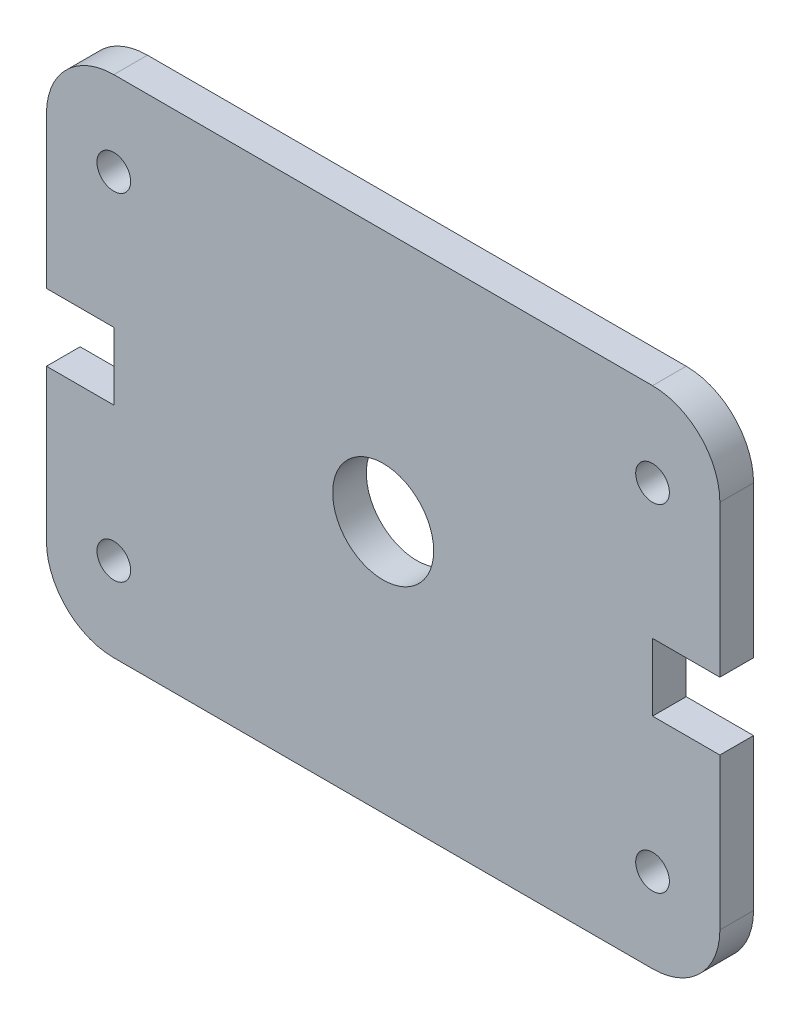
ISO-10303-21;
HEADER;
FILE_DESCRIPTION(('STEP AP214'),'2;1');
FILE_NAME('part.step','',(''),(''),'','','');
FILE_SCHEMA(('AUTOMOTIVE_DESIGN { 1 0 10303 214 1 1 1 1 }'));
ENDSEC;
DATA;
#1=APPLICATION_CONTEXT('core data for automotive mechanical design processes');
#2=APPLICATION_PROTOCOL_DEFINITION('international standard','automotive_design',2000,#1);
#3=PRODUCT_CONTEXT('',#1,'mechanical');
#4=PRODUCT('Part','Part','',(#3));
#5=PRODUCT_RELATED_PRODUCT_CATEGORY('part','',(#4));
#6=PRODUCT_DEFINITION_FORMATION('','',#4);
#7=PRODUCT_DEFINITION_CONTEXT('part definition',#1,'design');
#8=PRODUCT_DEFINITION('design','',#6,#7);
#9=PRODUCT_DEFINITION_SHAPE('','',#8);
#10=(LENGTH_UNIT() NAMED_UNIT(*) SI_UNIT(.MILLI.,.METRE.));
#11=(NAMED_UNIT(*) PLANE_ANGLE_UNIT() SI_UNIT($,.RADIAN.));
#12=(NAMED_UNIT(*) SI_UNIT($,.STERADIAN.) SOLID_ANGLE_UNIT());
#13=UNCERTAINTY_MEASURE_WITH_UNIT(LENGTH_MEASURE(1.E-05),#10,'distance_accuracy_value','');
#14=(GEOMETRIC_REPRESENTATION_CONTEXT(3) GLOBAL_UNCERTAINTY_ASSIGNED_CONTEXT((#13)) GLOBAL_UNIT_ASSIGNED_CONTEXT((#10,
#11,#12)) REPRESENTATION_CONTEXT('',''));
#15=CARTESIAN_POINT('',(0.,0.,0.));
#16=DIRECTION('',(0.,0.,1.));
#17=DIRECTION('',(1.,0.,0.));
#18=AXIS2_PLACEMENT_3D('',#15,#16,#17);
#19=CARTESIAN_POINT('',(50.,-27.4999999999999,2.5));
#20=DIRECTION('',(-1.,0.,0.));
#21=DIRECTION('',(0.,0.,1.));
#22=AXIS2_PLACEMENT_3D('',#19,#20,#21);
#23=PLANE('',#22);
#24=DIRECTION('',(0.,1.,0.));
#25=VECTOR('',#24,1.);
#26=CARTESIAN_POINT('',(50.,-27.4999999999999,2.5));
#27=LINE('',#26,#25);
#28=CARTESIAN_POINT('',(50.,5.,2.5));
#29=VERTEX_POINT('',#28);
#30=CARTESIAN_POINT('',(50.,27.4999999999999,2.5));
#31=VERTEX_POINT('',#30);
#32=EDGE_CURVE('E258',#29,#31,#27,.T.);
#33=ORIENTED_EDGE('',*,*,#32,.F.);
#34=DIRECTION('',(0.,0.,-1.));
#35=VECTOR('',#34,1.);
#36=CARTESIAN_POINT('',(50.,5.,7.5));
#37=LINE('',#36,#35);
#38=CARTESIAN_POINT('',(50.,5.,-2.5));
#39=VERTEX_POINT('',#38);
#40=EDGE_CURVE('E174',#29,#39,#37,.T.);
#41=ORIENTED_EDGE('',*,*,#40,.T.);
#42=DIRECTION('',(0.,1.,0.));
#43=VECTOR('',#42,1.);
#44=CARTESIAN_POINT('',(50.,-27.4999999999999,-2.5));
#45=LINE('',#44,#43);
#46=CARTESIAN_POINT('',(50.,27.4999999999999,-2.5));
#47=VERTEX_POINT('',#46);
#48=EDGE_CURVE('E279',#39,#47,#45,.T.);
#49=ORIENTED_EDGE('',*,*,#48,.T.);
#50=DIRECTION('',(0.,0.,-1.));
#51=VECTOR('',#50,1.);
#52=CARTESIAN_POINT('',(50.,27.4999999999999,2.5));
#53=LINE('',#52,#51);
#54=EDGE_CURVE('E262',#31,#47,#53,.T.);
#55=ORIENTED_EDGE('',*,*,#54,.F.);
#56=EDGE_LOOP('',(#33,#41,#49,#55));
#57=FACE_BOUND('',#56,.T.);
#58=ADVANCED_FACE('F35',(#57),#23,.F.);
#59=CARTESIAN_POINT('',(-50.,-27.4999999999999,2.5));
#60=DIRECTION('',(1.,0.,0.));
#61=DIRECTION('',(0.,0.,-1.));
#62=AXIS2_PLACEMENT_3D('',#59,#60,#61);
#63=PLANE('',#62);
#64=DIRECTION('',(0.,-1.,0.));
#65=VECTOR('',#64,1.);
#66=CARTESIAN_POINT('',(-50.,-27.4999999999999,2.5));
#67=LINE('',#66,#65);
#68=CARTESIAN_POINT('',(-50.,-5.,2.5));
#69=VERTEX_POINT('',#68);
#70=CARTESIAN_POINT('',(-50.,-27.4999999999999,2.5));
#71=VERTEX_POINT('',#70);
#72=EDGE_CURVE('E248',#69,#71,#67,.T.);
#73=ORIENTED_EDGE('',*,*,#72,.F.);
#74=DIRECTION('',(0.,0.,-1.));
#75=VECTOR('',#74,1.);
#76=CARTESIAN_POINT('',(-50.,-5.,7.5));
#77=LINE('',#76,#75);
#78=CARTESIAN_POINT('',(-50.,-5.,-2.5));
#79=VERTEX_POINT('',#78);
#80=EDGE_CURVE('E192',#69,#79,#77,.T.);
#81=ORIENTED_EDGE('',*,*,#80,.T.);
#82=DIRECTION('',(0.,-1.,0.));
#83=VECTOR('',#82,1.);
#84=CARTESIAN_POINT('',(-50.,-27.4999999999999,-2.5));
#85=LINE('',#84,#83);
#86=CARTESIAN_POINT('',(-50.,-27.4999999999999,-2.5));
#87=VERTEX_POINT('',#86);
#88=EDGE_CURVE('E269',#79,#87,#85,.T.);
#89=ORIENTED_EDGE('',*,*,#88,.T.);
#90=DIRECTION('',(0.,0.,-1.));
#91=VECTOR('',#90,1.);
#92=CARTESIAN_POINT('',(-50.,-27.4999999999999,2.5));
#93=LINE('',#92,#91);
#94=EDGE_CURVE('E292',#71,#87,#93,.T.);
#95=ORIENTED_EDGE('',*,*,#94,.F.);
#96=EDGE_LOOP('',(#73,#81,#89,#95));
#97=FACE_BOUND('',#96,.T.);
#98=ADVANCED_FACE('F345',(#97),#63,.F.);
#99=CARTESIAN_POINT('',(40.,27.5,2.5));
#100=DIRECTION('',(0.,0.,-1.));
#101=DIRECTION('',(-1.,0.,0.));
#102=AXIS2_PLACEMENT_3D('',#99,#100,#101);
#103=CYLINDRICAL_SURFACE('',#102,10.);
#104=CARTESIAN_POINT('',(40.,27.5,-2.5));
#105=DIRECTION('',(0.,0.,1.));
#106=DIRECTION('',(-1.,0.,0.));
#107=AXIS2_PLACEMENT_3D('',#104,#105,#106);
#108=CIRCLE('',#107,10.);
#109=CARTESIAN_POINT('',(39.9999999999999,37.5,-2.5));
#110=VERTEX_POINT('',#109);
#111=EDGE_CURVE('E237',#47,#110,#108,.T.);
#112=ORIENTED_EDGE('',*,*,#111,.T.);
#113=DIRECTION('',(0.,0.,-1.));
#114=VECTOR('',#113,1.);
#115=CARTESIAN_POINT('',(39.9999999999999,37.5,2.5));
#116=LINE('',#115,#114);
#117=CARTESIAN_POINT('',(39.9999999999999,37.5,2.5));
#118=VERTEX_POINT('',#117);
#119=EDGE_CURVE('E11',#118,#110,#116,.T.);
#120=ORIENTED_EDGE('',*,*,#119,.F.);
#121=CARTESIAN_POINT('',(40.,27.5,2.5));
#122=DIRECTION('',(0.,0.,1.));
#123=DIRECTION('',(-1.,0.,0.));
#124=AXIS2_PLACEMENT_3D('',#121,#122,#123);
#125=CIRCLE('',#124,10.);
#126=EDGE_CURVE('E240',#31,#118,#125,.T.);
#127=ORIENTED_EDGE('',*,*,#126,.F.);
#128=ORIENTED_EDGE('',*,*,#54,.T.);
#129=EDGE_LOOP('',(#112,#120,#127,#128));
#130=FACE_BOUND('',#129,.T.);
#131=ADVANCED_FACE('F37',(#130),#103,.T.);
#132=CARTESIAN_POINT('',(-39.9999999999999,37.5,2.5));
#133=DIRECTION('',(0.,-1.,0.));
#134=DIRECTION('',(0.,0.,-1.));
#135=AXIS2_PLACEMENT_3D('',#132,#133,#134);
#136=PLANE('',#135);
#137=DIRECTION('',(-1.,0.,0.));
#138=VECTOR('',#137,1.);
#139=CARTESIAN_POINT('',(-39.9999999999999,37.5,-2.5));
#140=LINE('',#139,#138);
#141=CARTESIAN_POINT('',(-39.9999999999999,37.5,-2.5));
#142=VERTEX_POINT('',#141);
#143=EDGE_CURVE('E265',#110,#142,#140,.T.);
#144=ORIENTED_EDGE('',*,*,#143,.T.);
#145=DIRECTION('',(0.,0.,-1.));
#146=VECTOR('',#145,1.);
#147=CARTESIAN_POINT('',(-39.9999999999999,37.5,2.5));
#148=LINE('',#147,#146);
#149=CARTESIAN_POINT('',(-39.9999999999999,37.5,2.5));
#150=VERTEX_POINT('',#149);
#151=EDGE_CURVE('E43',#150,#142,#148,.T.);
#152=ORIENTED_EDGE('',*,*,#151,.F.);
#153=DIRECTION('',(-1.,0.,0.));
#154=VECTOR('',#153,1.);
#155=CARTESIAN_POINT('',(-39.9999999999999,37.5,2.5));
#156=LINE('',#155,#154);
#157=EDGE_CURVE('E243',#118,#150,#156,.T.);
#158=ORIENTED_EDGE('',*,*,#157,.F.);
#159=ORIENTED_EDGE('',*,*,#119,.T.);
#160=EDGE_LOOP('',(#144,#152,#158,#159));
#161=FACE_BOUND('',#160,.T.);
#162=ADVANCED_FACE('F315',(#161),#136,.F.);
#163=CARTESIAN_POINT('',(-40.,27.5,2.5));
#164=DIRECTION('',(0.,0.,-1.));
#165=DIRECTION('',(-1.,0.,0.));
#166=AXIS2_PLACEMENT_3D('',#163,#164,#165);
#167=CYLINDRICAL_SURFACE('',#166,10.);
#168=CARTESIAN_POINT('',(-40.,27.5,-2.5));
#169=DIRECTION('',(0.,0.,1.));
#170=DIRECTION('',(1.,0.,0.));
#171=AXIS2_PLACEMENT_3D('',#168,#169,#170);
#172=CIRCLE('',#171,10.);
#173=CARTESIAN_POINT('',(-50.,27.4999999999999,-2.5));
#174=VERTEX_POINT('',#173);
#175=EDGE_CURVE('E267',#142,#174,#172,.T.);
#176=ORIENTED_EDGE('',*,*,#175,.T.);
#177=DIRECTION('',(0.,0.,-1.));
#178=VECTOR('',#177,1.);
#179=CARTESIAN_POINT('',(-50.,27.4999999999999,2.5));
#180=LINE('',#179,#178);
#181=CARTESIAN_POINT('',(-50.,27.4999999999999,2.5));
#182=VERTEX_POINT('',#181);
#183=EDGE_CURVE('E295',#182,#174,#180,.T.);
#184=ORIENTED_EDGE('',*,*,#183,.F.);
#185=CARTESIAN_POINT('',(-40.,27.5,2.5));
#186=DIRECTION('',(0.,0.,1.));
#187=DIRECTION('',(1.,0.,0.));
#188=AXIS2_PLACEMENT_3D('',#185,#186,#187);
#189=CIRCLE('',#188,10.);
#190=EDGE_CURVE('E246',#150,#182,#189,.T.);
#191=ORIENTED_EDGE('',*,*,#190,.F.);
#192=ORIENTED_EDGE('',*,*,#151,.T.);
#193=EDGE_LOOP('',(#176,#184,#191,#192));
#194=FACE_BOUND('',#193,.T.);
#195=ADVANCED_FACE('F302',(#194),#167,.T.);
#196=CARTESIAN_POINT('',(-50.,5.,-2.5));
#197=VERTEX_POINT('',#196);
#198=EDGE_CURVE('E270',#174,#197,#85,.T.);
#199=ORIENTED_EDGE('',*,*,#198,.T.);
#200=DIRECTION('',(0.,0.,-1.));
#201=VECTOR('',#200,1.);
#202=CARTESIAN_POINT('',(-50.,5.,7.5));
#203=LINE('',#202,#201);
#204=CARTESIAN_POINT('',(-50.,5.,2.5));
#205=VERTEX_POINT('',#204);
#206=EDGE_CURVE('E58',#205,#197,#203,.T.);
#207=ORIENTED_EDGE('',*,*,#206,.F.);
#208=EDGE_CURVE('E249',#182,#205,#67,.T.);
#209=ORIENTED_EDGE('',*,*,#208,.F.);
#210=ORIENTED_EDGE('',*,*,#183,.T.);
#211=EDGE_LOOP('',(#199,#207,#209,#210));
#212=FACE_BOUND('',#211,.T.);
#213=ADVANCED_FACE('F309',(#212),#63,.F.);
#214=CARTESIAN_POINT('',(-40.,-27.5,2.5));
#215=DIRECTION('',(0.,0.,-1.));
#216=DIRECTION('',(-1.,0.,0.));
#217=AXIS2_PLACEMENT_3D('',#214,#215,#216);
#218=CYLINDRICAL_SURFACE('',#217,10.);
#219=CARTESIAN_POINT('',(-40.,-27.5,-2.5));
#220=DIRECTION('',(0.,0.,1.));
#221=DIRECTION('',(-1.,0.,0.));
#222=AXIS2_PLACEMENT_3D('',#219,#220,#221);
#223=CIRCLE('',#222,10.);
#224=CARTESIAN_POINT('',(-39.9999999999999,-37.5,-2.5));
#225=VERTEX_POINT('',#224);
#226=EDGE_CURVE('E273',#87,#225,#223,.T.);
#227=ORIENTED_EDGE('',*,*,#226,.T.);
#228=DIRECTION('',(0.,0.,-1.));
#229=VECTOR('',#228,1.);
#230=CARTESIAN_POINT('',(-39.9999999999999,-37.5,2.5));
#231=LINE('',#230,#229);
#232=CARTESIAN_POINT('',(-39.9999999999999,-37.5,2.5));
#233=VERTEX_POINT('',#232);
#234=EDGE_CURVE('E289',#233,#225,#231,.T.);
#235=ORIENTED_EDGE('',*,*,#234,.F.);
#236=CARTESIAN_POINT('',(-40.,-27.5,2.5));
#237=DIRECTION('',(0.,0.,1.));
#238=DIRECTION('',(-1.,0.,0.));
#239=AXIS2_PLACEMENT_3D('',#236,#237,#238);
#240=CIRCLE('',#239,10.);
#241=EDGE_CURVE('E252',#71,#233,#240,.T.);
#242=ORIENTED_EDGE('',*,*,#241,.F.);
#243=ORIENTED_EDGE('',*,*,#94,.T.);
#244=EDGE_LOOP('',(#227,#235,#242,#243));
#245=FACE_BOUND('',#244,.T.);
#246=ADVANCED_FACE('F339',(#245),#218,.T.);
#247=CARTESIAN_POINT('',(-39.9999999999999,-37.5,2.5));
#248=DIRECTION('',(0.,1.,0.));
#249=DIRECTION('',(0.,0.,1.));
#250=AXIS2_PLACEMENT_3D('',#247,#248,#249);
#251=PLANE('',#250);
#252=DIRECTION('',(1.,0.,0.));
#253=VECTOR('',#252,1.);
#254=CARTESIAN_POINT('',(-39.9999999999999,-37.5,-2.5));
#255=LINE('',#254,#253);
#256=CARTESIAN_POINT('',(39.9999999999999,-37.5,-2.5));
#257=VERTEX_POINT('',#256);
#258=EDGE_CURVE('E275',#225,#257,#255,.T.);
#259=ORIENTED_EDGE('',*,*,#258,.T.);
#260=DIRECTION('',(0.,0.,-1.));
#261=VECTOR('',#260,1.);
#262=CARTESIAN_POINT('',(39.9999999999999,-37.5,2.5));
#263=LINE('',#262,#261);
#264=CARTESIAN_POINT('',(39.9999999999999,-37.5,2.5));
#265=VERTEX_POINT('',#264);
#266=EDGE_CURVE('E286',#265,#257,#263,.T.);
#267=ORIENTED_EDGE('',*,*,#266,.F.);
#268=DIRECTION('',(1.,0.,0.));
#269=VECTOR('',#268,1.);
#270=CARTESIAN_POINT('',(-39.9999999999999,-37.5,2.5));
#271=LINE('',#270,#269);
#272=EDGE_CURVE('E254',#233,#265,#271,.T.);
#273=ORIENTED_EDGE('',*,*,#272,.F.);
#274=ORIENTED_EDGE('',*,*,#234,.T.);
#275=EDGE_LOOP('',(#259,#267,#273,#274));
#276=FACE_BOUND('',#275,.T.);
#277=ADVANCED_FACE('F335',(#276),#251,.F.);
#278=CARTESIAN_POINT('',(40.,-27.5,2.5));
#279=DIRECTION('',(0.,0.,-1.));
#280=DIRECTION('',(-1.,0.,0.));
#281=AXIS2_PLACEMENT_3D('',#278,#279,#280);
#282=CYLINDRICAL_SURFACE('',#281,10.);
#283=CARTESIAN_POINT('',(40.,-27.5,-2.5));
#284=DIRECTION('',(0.,0.,1.));
#285=DIRECTION('',(-1.,0.,0.));
#286=AXIS2_PLACEMENT_3D('',#283,#284,#285);
#287=CIRCLE('',#286,10.);
#288=CARTESIAN_POINT('',(50.,-27.4999999999999,-2.5));
#289=VERTEX_POINT('',#288);
#290=EDGE_CURVE('E277',#257,#289,#287,.T.);
#291=ORIENTED_EDGE('',*,*,#290,.T.);
#292=DIRECTION('',(0.,0.,-1.));
#293=VECTOR('',#292,1.);
#294=CARTESIAN_POINT('',(50.,-27.4999999999999,2.5));
#295=LINE('',#294,#293);
#296=CARTESIAN_POINT('',(50.,-27.4999999999999,2.5));
#297=VERTEX_POINT('',#296);
#298=EDGE_CURVE('E283',#297,#289,#295,.T.);
#299=ORIENTED_EDGE('',*,*,#298,.F.);
#300=CARTESIAN_POINT('',(40.,-27.5,2.5));
#301=DIRECTION('',(0.,0.,1.));
#302=DIRECTION('',(-1.,0.,0.));
#303=AXIS2_PLACEMENT_3D('',#300,#301,#302);
#304=CIRCLE('',#303,10.);
#305=EDGE_CURVE('E256',#265,#297,#304,.T.);
#306=ORIENTED_EDGE('',*,*,#305,.F.);
#307=ORIENTED_EDGE('',*,*,#266,.T.);
#308=EDGE_LOOP('',(#291,#299,#306,#307));
#309=FACE_BOUND('',#308,.T.);
#310=ADVANCED_FACE('F330',(#309),#282,.T.);
#311=CARTESIAN_POINT('',(50.,-5.,-2.5));
#312=VERTEX_POINT('',#311);
#313=EDGE_CURVE('E244',#289,#312,#45,.T.);
#314=ORIENTED_EDGE('',*,*,#313,.T.);
#315=DIRECTION('',(0.,0.,-1.));
#316=VECTOR('',#315,1.);
#317=CARTESIAN_POINT('',(50.,-5.,7.5));
#318=LINE('',#317,#316);
#319=CARTESIAN_POINT('',(50.,-5.,2.5));
#320=VERTEX_POINT('',#319);
#321=EDGE_CURVE('E50',#320,#312,#318,.T.);
#322=ORIENTED_EDGE('',*,*,#321,.F.);
#323=EDGE_CURVE('E259',#297,#320,#27,.T.);
#324=ORIENTED_EDGE('',*,*,#323,.F.);
#325=ORIENTED_EDGE('',*,*,#298,.T.);
#326=EDGE_LOOP('',(#314,#322,#324,#325));
#327=FACE_BOUND('',#326,.T.);
#328=ADVANCED_FACE('F324',(#327),#23,.F.);
#329=CARTESIAN_POINT('',(40.,27.5,2.5));
#330=DIRECTION('',(0.,0.,-1.));
#331=DIRECTION('',(-1.,0.,0.));
#332=AXIS2_PLACEMENT_3D('',#329,#330,#331);
#333=PLANE('',#332);
#334=CARTESIAN_POINT('',(-40.,25.,2.5));
#335=DIRECTION('',(0.,0.,1.));
#336=DIRECTION('',(1.,0.,0.));
#337=AXIS2_PLACEMENT_3D('',#334,#335,#336);
#338=CIRCLE('',#337,2.5);
#339=CARTESIAN_POINT('',(-37.5,25.,2.5));
#340=VERTEX_POINT('',#339);
#341=EDGE_CURVE('E214',#340,#340,#338,.T.);
#342=ORIENTED_EDGE('',*,*,#341,.F.);
#343=EDGE_LOOP('',(#342));
#344=FACE_BOUND('',#343,.T.);
#345=CARTESIAN_POINT('',(-40.,-25.,2.5));
#346=DIRECTION('',(0.,0.,1.));
#347=DIRECTION('',(1.,0.,0.));
#348=AXIS2_PLACEMENT_3D('',#345,#346,#347);
#349=CIRCLE('',#348,2.5);
#350=CARTESIAN_POINT('',(-37.5,-25.,2.5));
#351=VERTEX_POINT('',#350);
#352=EDGE_CURVE('E220',#351,#351,#349,.T.);
#353=ORIENTED_EDGE('',*,*,#352,.F.);
#354=EDGE_LOOP('',(#353));
#355=FACE_BOUND('',#354,.T.);
#356=CARTESIAN_POINT('',(40.,-25.,2.5));
#357=DIRECTION('',(0.,0.,1.));
#358=DIRECTION('',(1.,0.,0.));
#359=AXIS2_PLACEMENT_3D('',#356,#357,#358);
#360=CIRCLE('',#359,2.5);
#361=CARTESIAN_POINT('',(42.5,-25.,2.5));
#362=VERTEX_POINT('',#361);
#363=EDGE_CURVE('E226',#362,#362,#360,.T.);
#364=ORIENTED_EDGE('',*,*,#363,.F.);
#365=EDGE_LOOP('',(#364));
#366=FACE_BOUND('',#365,.T.);
#367=CARTESIAN_POINT('',(0.,0.,2.5));
#368=DIRECTION('',(0.,0.,1.));
#369=DIRECTION('',(1.,0.,0.));
#370=AXIS2_PLACEMENT_3D('',#367,#368,#369);
#371=CIRCLE('',#370,7.5);
#372=CARTESIAN_POINT('',(7.5,0.,2.5));
#373=VERTEX_POINT('',#372);
#374=EDGE_CURVE('E209',#373,#373,#371,.T.);
#375=ORIENTED_EDGE('',*,*,#374,.F.);
#376=EDGE_LOOP('',(#375));
#377=FACE_BOUND('',#376,.T.);
#378=CARTESIAN_POINT('',(40.,25.,2.5));
#379=DIRECTION('',(0.,0.,1.));
#380=DIRECTION('',(1.,0.,0.));
#381=AXIS2_PLACEMENT_3D('',#378,#379,#380);
#382=CIRCLE('',#381,2.5);
#383=CARTESIAN_POINT('',(42.5,25.,2.5));
#384=VERTEX_POINT('',#383);
#385=EDGE_CURVE('E213',#384,#384,#382,.T.);
#386=ORIENTED_EDGE('',*,*,#385,.F.);
#387=EDGE_LOOP('',(#386));
#388=FACE_BOUND('',#387,.T.);
#389=DIRECTION('',(0.,1.,0.));
#390=VECTOR('',#389,1.);
#391=CARTESIAN_POINT('',(40.,27.5,2.5));
#392=LINE('',#391,#390);
#393=CARTESIAN_POINT('',(40.,-5.,2.5));
#394=VERTEX_POINT('',#393);
#395=CARTESIAN_POINT('',(40.,5.,2.5));
#396=VERTEX_POINT('',#395);
#397=EDGE_CURVE('E157',#394,#396,#392,.T.);
#398=ORIENTED_EDGE('',*,*,#397,.T.);
#399=DIRECTION('',(1.,0.,0.));
#400=VECTOR('',#399,1.);
#401=CARTESIAN_POINT('',(40.,5.,2.5));
#402=LINE('',#401,#400);
#403=EDGE_CURVE('E182',#396,#29,#402,.T.);
#404=ORIENTED_EDGE('',*,*,#403,.T.);
#405=ORIENTED_EDGE('',*,*,#32,.T.);
#406=ORIENTED_EDGE('',*,*,#126,.T.);
#407=ORIENTED_EDGE('',*,*,#157,.T.);
#408=ORIENTED_EDGE('',*,*,#190,.T.);
#409=ORIENTED_EDGE('',*,*,#208,.T.);
#410=DIRECTION('',(1.,0.,0.));
#411=VECTOR('',#410,1.);
#412=CARTESIAN_POINT('',(40.,5.00000000000004,2.5));
#413=LINE('',#412,#411);
#414=CARTESIAN_POINT('',(-40.,5.,2.5));
#415=VERTEX_POINT('',#414);
#416=EDGE_CURVE('E195',#205,#415,#413,.T.);
#417=ORIENTED_EDGE('',*,*,#416,.T.);
#418=DIRECTION('',(0.,-1.,0.));
#419=VECTOR('',#418,1.);
#420=CARTESIAN_POINT('',(-40.,27.5,2.5));
#421=LINE('',#420,#419);
#422=CARTESIAN_POINT('',(-40.,-5.,2.5));
#423=VERTEX_POINT('',#422);
#424=EDGE_CURVE('E203',#415,#423,#421,.T.);
#425=ORIENTED_EDGE('',*,*,#424,.T.);
#426=DIRECTION('',(-1.,0.,0.));
#427=VECTOR('',#426,1.);
#428=CARTESIAN_POINT('',(40.,-5.00000000000001,2.5));
#429=LINE('',#428,#427);
#430=EDGE_CURVE('E206',#423,#69,#429,.T.);
#431=ORIENTED_EDGE('',*,*,#430,.T.);
#432=ORIENTED_EDGE('',*,*,#72,.T.);
#433=ORIENTED_EDGE('',*,*,#241,.T.);
#434=ORIENTED_EDGE('',*,*,#272,.T.);
#435=ORIENTED_EDGE('',*,*,#305,.T.);
#436=ORIENTED_EDGE('',*,*,#323,.T.);
#437=DIRECTION('',(-1.,0.,0.));
#438=VECTOR('',#437,1.);
#439=CARTESIAN_POINT('',(40.,-5.,2.5));
#440=LINE('',#439,#438);
#441=EDGE_CURVE('E177',#320,#394,#440,.T.);
#442=ORIENTED_EDGE('',*,*,#441,.T.);
#443=EDGE_LOOP('',(#398,#404,#405,#406,#407,#408,#409,#417,#425,#431,#432,#433,#434,#435,#436,#442));
#444=FACE_BOUND('',#443,.T.);
#445=ADVANCED_FACE('F312',(#344,#355,#366,#377,#388,#444),#333,.F.);
#446=CARTESIAN_POINT('',(40.,27.5,-2.5));
#447=DIRECTION('',(0.,0.,-1.));
#448=DIRECTION('',(-1.,0.,0.));
#449=AXIS2_PLACEMENT_3D('',#446,#447,#448);
#450=PLANE('',#449);
#451=DIRECTION('',(1.,0.,0.));
#452=VECTOR('',#451,1.);
#453=CARTESIAN_POINT('',(50.,5.,-2.5));
#454=LINE('',#453,#452);
#455=CARTESIAN_POINT('',(40.,5.,-2.5));
#456=VERTEX_POINT('',#455);
#457=EDGE_CURVE('E170',#456,#39,#454,.T.);
#458=ORIENTED_EDGE('',*,*,#457,.F.);
#459=DIRECTION('',(0.,1.,0.));
#460=VECTOR('',#459,1.);
#461=CARTESIAN_POINT('',(40.,5.,-2.5));
#462=LINE('',#461,#460);
#463=CARTESIAN_POINT('',(40.,-5.,-2.5));
#464=VERTEX_POINT('',#463);
#465=EDGE_CURVE('E154',#464,#456,#462,.T.);
#466=ORIENTED_EDGE('',*,*,#465,.F.);
#467=DIRECTION('',(-1.,0.,0.));
#468=VECTOR('',#467,1.);
#469=CARTESIAN_POINT('',(50.,-5.,-2.5));
#470=LINE('',#469,#468);
#471=EDGE_CURVE('E161',#312,#464,#470,.T.);
#472=ORIENTED_EDGE('',*,*,#471,.F.);
#473=ORIENTED_EDGE('',*,*,#313,.F.);
#474=ORIENTED_EDGE('',*,*,#290,.F.);
#475=ORIENTED_EDGE('',*,*,#258,.F.);
#476=ORIENTED_EDGE('',*,*,#226,.F.);
#477=ORIENTED_EDGE('',*,*,#88,.F.);
#478=DIRECTION('',(-1.,0.,0.));
#479=VECTOR('',#478,1.);
#480=CARTESIAN_POINT('',(-50.,-5.,-2.5));
#481=LINE('',#480,#479);
#482=CARTESIAN_POINT('',(-40.,-5.,-2.5));
#483=VERTEX_POINT('',#482);
#484=EDGE_CURVE('E190',#483,#79,#481,.T.);
#485=ORIENTED_EDGE('',*,*,#484,.F.);
#486=DIRECTION('',(0.,-1.,0.));
#487=VECTOR('',#486,1.);
#488=CARTESIAN_POINT('',(-40.,5.,-2.5));
#489=LINE('',#488,#487);
#490=CARTESIAN_POINT('',(-40.,5.,-2.5));
#491=VERTEX_POINT('',#490);
#492=EDGE_CURVE('E187',#491,#483,#489,.T.);
#493=ORIENTED_EDGE('',*,*,#492,.F.);
#494=DIRECTION('',(1.,0.,0.));
#495=VECTOR('',#494,1.);
#496=CARTESIAN_POINT('',(-50.,5.,-2.5));
#497=LINE('',#496,#495);
#498=EDGE_CURVE('E185',#197,#491,#497,.T.);
#499=ORIENTED_EDGE('',*,*,#498,.F.);
#500=ORIENTED_EDGE('',*,*,#198,.F.);
#501=ORIENTED_EDGE('',*,*,#175,.F.);
#502=ORIENTED_EDGE('',*,*,#143,.F.);
#503=ORIENTED_EDGE('',*,*,#111,.F.);
#504=ORIENTED_EDGE('',*,*,#48,.F.);
#505=EDGE_LOOP('',(#458,#466,#472,#473,#474,#475,#476,#477,#485,#493,#499,#500,#501,#502,#503,#504));
#506=FACE_BOUND('',#505,.T.);
#507=CARTESIAN_POINT('',(-40.,25.,-2.5));
#508=DIRECTION('',(0.,0.,1.));
#509=DIRECTION('',(1.,0.,0.));
#510=AXIS2_PLACEMENT_3D('',#507,#508,#509);
#511=CIRCLE('',#510,2.5);
#512=CARTESIAN_POINT('',(-37.5,25.,-2.5));
#513=VERTEX_POINT('',#512);
#514=EDGE_CURVE('E210',#513,#513,#511,.T.);
#515=ORIENTED_EDGE('',*,*,#514,.T.);
#516=EDGE_LOOP('',(#515));
#517=FACE_BOUND('',#516,.T.);
#518=CARTESIAN_POINT('',(-40.,-25.,-2.5));
#519=DIRECTION('',(0.,0.,1.));
#520=DIRECTION('',(1.,0.,0.));
#521=AXIS2_PLACEMENT_3D('',#518,#519,#520);
#522=CIRCLE('',#521,2.5);
#523=CARTESIAN_POINT('',(-37.5,-25.,-2.5));
#524=VERTEX_POINT('',#523);
#525=EDGE_CURVE('E217',#524,#524,#522,.T.);
#526=ORIENTED_EDGE('',*,*,#525,.T.);
#527=EDGE_LOOP('',(#526));
#528=FACE_BOUND('',#527,.T.);
#529=CARTESIAN_POINT('',(40.,-25.,-2.5));
#530=DIRECTION('',(0.,0.,1.));
#531=DIRECTION('',(1.,0.,0.));
#532=AXIS2_PLACEMENT_3D('',#529,#530,#531);
#533=CIRCLE('',#532,2.5);
#534=CARTESIAN_POINT('',(42.5,-25.,-2.5));
#535=VERTEX_POINT('',#534);
#536=EDGE_CURVE('E223',#535,#535,#533,.T.);
#537=ORIENTED_EDGE('',*,*,#536,.T.);
#538=EDGE_LOOP('',(#537));
#539=FACE_BOUND('',#538,.T.);
#540=CARTESIAN_POINT('',(0.,0.,-2.5));
#541=DIRECTION('',(0.,0.,1.));
#542=DIRECTION('',(1.,0.,0.));
#543=AXIS2_PLACEMENT_3D('',#540,#541,#542);
#544=CIRCLE('',#543,7.5);
#545=CARTESIAN_POINT('',(7.5,0.,-2.5));
#546=VERTEX_POINT('',#545);
#547=EDGE_CURVE('E229',#546,#546,#544,.T.);
#548=ORIENTED_EDGE('',*,*,#547,.T.);
#549=EDGE_LOOP('',(#548));
#550=FACE_BOUND('',#549,.T.);
#551=CARTESIAN_POINT('',(40.,25.,-2.5));
#552=DIRECTION('',(0.,0.,1.));
#553=DIRECTION('',(1.,0.,0.));
#554=AXIS2_PLACEMENT_3D('',#551,#552,#553);
#555=CIRCLE('',#554,2.5);
#556=CARTESIAN_POINT('',(42.5,25.,-2.5));
#557=VERTEX_POINT('',#556);
#558=EDGE_CURVE('E234',#557,#557,#555,.T.);
#559=ORIENTED_EDGE('',*,*,#558,.T.);
#560=EDGE_LOOP('',(#559));
#561=FACE_BOUND('',#560,.T.);
#562=ADVANCED_FACE('F167',(#506,#517,#528,#539,#550,#561),#450,.T.);
#563=CARTESIAN_POINT('',(40.,25.,-2.5));
#564=DIRECTION('',(0.,0.,1.));
#565=DIRECTION('',(1.,0.,0.));
#566=AXIS2_PLACEMENT_3D('',#563,#564,#565);
#567=CYLINDRICAL_SURFACE('',#566,2.5);
#568=ORIENTED_EDGE('',*,*,#558,.F.);
#569=EDGE_LOOP('',(#568));
#570=FACE_BOUND('',#569,.T.);
#571=ORIENTED_EDGE('',*,*,#385,.T.);
#572=EDGE_LOOP('',(#571));
#573=FACE_BOUND('',#572,.T.);
#574=ADVANCED_FACE('F428',(#570,#573),#567,.F.);
#575=CARTESIAN_POINT('',(0.,0.,-2.5));
#576=DIRECTION('',(0.,0.,1.));
#577=DIRECTION('',(1.,0.,0.));
#578=AXIS2_PLACEMENT_3D('',#575,#576,#577);
#579=CYLINDRICAL_SURFACE('',#578,7.5);
#580=ORIENTED_EDGE('',*,*,#547,.F.);
#581=EDGE_LOOP('',(#580));
#582=FACE_BOUND('',#581,.T.);
#583=ORIENTED_EDGE('',*,*,#374,.T.);
#584=EDGE_LOOP('',(#583));
#585=FACE_BOUND('',#584,.T.);
#586=ADVANCED_FACE('F491',(#582,#585),#579,.F.);
#587=CARTESIAN_POINT('',(40.,-25.,-2.5));
#588=DIRECTION('',(0.,0.,1.));
#589=DIRECTION('',(1.,0.,0.));
#590=AXIS2_PLACEMENT_3D('',#587,#588,#589);
#591=CYLINDRICAL_SURFACE('',#590,2.5);
#592=ORIENTED_EDGE('',*,*,#536,.F.);
#593=EDGE_LOOP('',(#592));
#594=FACE_BOUND('',#593,.T.);
#595=ORIENTED_EDGE('',*,*,#363,.T.);
#596=EDGE_LOOP('',(#595));
#597=FACE_BOUND('',#596,.T.);
#598=ADVANCED_FACE('F483',(#594,#597),#591,.F.);
#599=CARTESIAN_POINT('',(-40.,-25.,-2.5));
#600=DIRECTION('',(0.,0.,1.));
#601=DIRECTION('',(1.,0.,0.));
#602=AXIS2_PLACEMENT_3D('',#599,#600,#601);
#603=CYLINDRICAL_SURFACE('',#602,2.5);
#604=ORIENTED_EDGE('',*,*,#525,.F.);
#605=EDGE_LOOP('',(#604));
#606=FACE_BOUND('',#605,.T.);
#607=ORIENTED_EDGE('',*,*,#352,.T.);
#608=EDGE_LOOP('',(#607));
#609=FACE_BOUND('',#608,.T.);
#610=ADVANCED_FACE('F477',(#606,#609),#603,.F.);
#611=CARTESIAN_POINT('',(-40.,25.,-2.5));
#612=DIRECTION('',(0.,0.,1.));
#613=DIRECTION('',(1.,0.,0.));
#614=AXIS2_PLACEMENT_3D('',#611,#612,#613);
#615=CYLINDRICAL_SURFACE('',#614,2.5);
#616=ORIENTED_EDGE('',*,*,#514,.F.);
#617=EDGE_LOOP('',(#616));
#618=FACE_BOUND('',#617,.T.);
#619=ORIENTED_EDGE('',*,*,#341,.T.);
#620=EDGE_LOOP('',(#619));
#621=FACE_BOUND('',#620,.T.);
#622=ADVANCED_FACE('F438',(#618,#621),#615,.F.);
#623=CARTESIAN_POINT('',(-50.,-5.,7.5));
#624=DIRECTION('',(0.,-1.,0.));
#625=DIRECTION('',(1.,0.,0.));
#626=AXIS2_PLACEMENT_3D('',#623,#624,#625);
#627=PLANE('',#626);
#628=DIRECTION('',(0.,0.,-1.));
#629=VECTOR('',#628,1.);
#630=CARTESIAN_POINT('',(-40.,-5.,7.5));
#631=LINE('',#630,#629);
#632=EDGE_CURVE('E196',#423,#483,#631,.T.);
#633=ORIENTED_EDGE('',*,*,#632,.T.);
#634=ORIENTED_EDGE('',*,*,#484,.T.);
#635=ORIENTED_EDGE('',*,*,#80,.F.);
#636=ORIENTED_EDGE('',*,*,#430,.F.);
#637=EDGE_LOOP('',(#633,#634,#635,#636));
#638=FACE_BOUND('',#637,.T.);
#639=ADVANCED_FACE('F347',(#638),#627,.F.);
#640=CARTESIAN_POINT('',(-40.,5.,7.5));
#641=DIRECTION('',(1.,0.,0.));
#642=DIRECTION('',(0.,0.,-1.));
#643=AXIS2_PLACEMENT_3D('',#640,#641,#642);
#644=PLANE('',#643);
#645=DIRECTION('',(0.,0.,-1.));
#646=VECTOR('',#645,1.);
#647=CARTESIAN_POINT('',(-40.,5.,7.5));
#648=LINE('',#647,#646);
#649=EDGE_CURVE('E198',#415,#491,#648,.T.);
#650=ORIENTED_EDGE('',*,*,#649,.T.);
#651=ORIENTED_EDGE('',*,*,#492,.T.);
#652=ORIENTED_EDGE('',*,*,#632,.F.);
#653=ORIENTED_EDGE('',*,*,#424,.F.);
#654=EDGE_LOOP('',(#650,#651,#652,#653));
#655=FACE_BOUND('',#654,.T.);
#656=ADVANCED_FACE('F351',(#655),#644,.F.);
#657=CARTESIAN_POINT('',(-50.,5.,7.5));
#658=DIRECTION('',(0.,1.,0.));
#659=DIRECTION('',(-1.,0.,0.));
#660=AXIS2_PLACEMENT_3D('',#657,#658,#659);
#661=PLANE('',#660);
#662=ORIENTED_EDGE('',*,*,#206,.T.);
#663=ORIENTED_EDGE('',*,*,#498,.T.);
#664=ORIENTED_EDGE('',*,*,#649,.F.);
#665=ORIENTED_EDGE('',*,*,#416,.F.);
#666=EDGE_LOOP('',(#662,#663,#664,#665));
#667=FACE_BOUND('',#666,.T.);
#668=ADVANCED_FACE('F352',(#667),#661,.F.);
#669=CARTESIAN_POINT('',(50.,5.,7.5));
#670=DIRECTION('',(0.,1.,0.));
#671=DIRECTION('',(-1.,0.,0.));
#672=AXIS2_PLACEMENT_3D('',#669,#670,#671);
#673=PLANE('',#672);
#674=DIRECTION('',(0.,0.,-1.));
#675=VECTOR('',#674,1.);
#676=CARTESIAN_POINT('',(40.,5.,7.5));
#677=LINE('',#676,#675);
#678=EDGE_CURVE('E159',#396,#456,#677,.T.);
#679=ORIENTED_EDGE('',*,*,#678,.T.);
#680=ORIENTED_EDGE('',*,*,#457,.T.);
#681=ORIENTED_EDGE('',*,*,#40,.F.);
#682=ORIENTED_EDGE('',*,*,#403,.F.);
#683=EDGE_LOOP('',(#679,#680,#681,#682));
#684=FACE_BOUND('',#683,.T.);
#685=ADVANCED_FACE('F321',(#684),#673,.F.);
#686=CARTESIAN_POINT('',(40.,5.,7.5));
#687=DIRECTION('',(-1.,0.,0.));
#688=DIRECTION('',(0.,0.,1.));
#689=AXIS2_PLACEMENT_3D('',#686,#687,#688);
#690=PLANE('',#689);
#691=DIRECTION('',(0.,0.,-1.));
#692=VECTOR('',#691,1.);
#693=CARTESIAN_POINT('',(40.,-5.,7.5));
#694=LINE('',#693,#692);
#695=EDGE_CURVE('E150',#394,#464,#694,.T.);
#696=ORIENTED_EDGE('',*,*,#695,.T.);
#697=ORIENTED_EDGE('',*,*,#465,.T.);
#698=ORIENTED_EDGE('',*,*,#678,.F.);
#699=ORIENTED_EDGE('',*,*,#397,.F.);
#700=EDGE_LOOP('',(#696,#697,#698,#699));
#701=FACE_BOUND('',#700,.T.);
#702=ADVANCED_FACE('F151',(#701),#690,.F.);
#703=CARTESIAN_POINT('',(50.,-5.,7.5));
#704=DIRECTION('',(0.,-1.,0.));
#705=DIRECTION('',(1.,0.,0.));
#706=AXIS2_PLACEMENT_3D('',#703,#704,#705);
#707=PLANE('',#706);
#708=ORIENTED_EDGE('',*,*,#321,.T.);
#709=ORIENTED_EDGE('',*,*,#471,.T.);
#710=ORIENTED_EDGE('',*,*,#695,.F.);
#711=ORIENTED_EDGE('',*,*,#441,.F.);
#712=EDGE_LOOP('',(#708,#709,#710,#711));
#713=FACE_BOUND('',#712,.T.);
#714=ADVANCED_FACE('F162',(#713),#707,.F.);
#715=CLOSED_SHELL('',(#58,#98,#131,#162,#195,#213,#246,#277,#310,#328,#445,#562,#574,#586,#598,
#610,#622,#639,#656,#668,#685,#702,#714));
#716=MANIFOLD_SOLID_BREP('B2',#715);
#717=ADVANCED_BREP_SHAPE_REPRESENTATION('',(#18,#716),#14);
#718=SHAPE_DEFINITION_REPRESENTATION(#9,#717);
ENDSEC;
END-ISO-10303-21;
